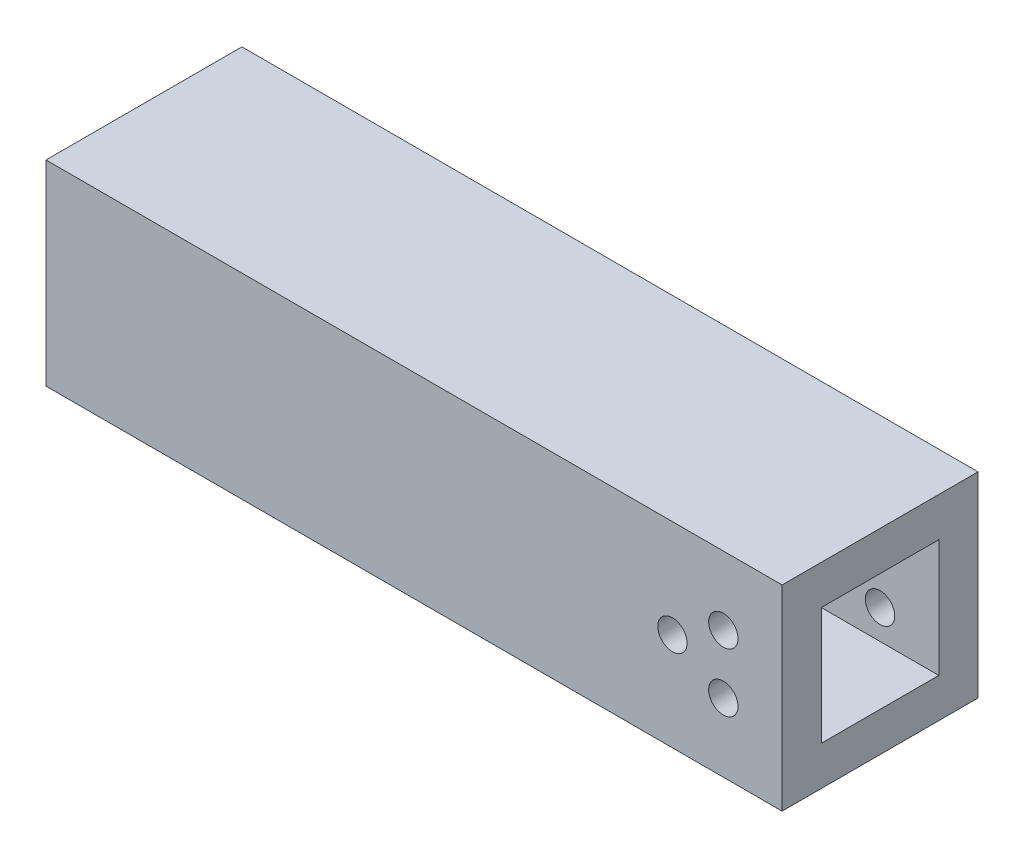
ISO-10303-21;
HEADER;
FILE_DESCRIPTION(('STEP AP214'),'2;1');
FILE_NAME('part.step','',(''),(''),'','','');
FILE_SCHEMA(('AUTOMOTIVE_DESIGN { 1 0 10303 214 1 1 1 1 }'));
ENDSEC;
DATA;
#1=APPLICATION_CONTEXT('core data for automotive mechanical design processes');
#2=APPLICATION_PROTOCOL_DEFINITION('international standard','automotive_design',2000,#1);
#3=PRODUCT_CONTEXT('',#1,'mechanical');
#4=PRODUCT('Part','Part','',(#3));
#5=PRODUCT_RELATED_PRODUCT_CATEGORY('part','',(#4));
#6=PRODUCT_DEFINITION_FORMATION('','',#4);
#7=PRODUCT_DEFINITION_CONTEXT('part definition',#1,'design');
#8=PRODUCT_DEFINITION('design','',#6,#7);
#9=PRODUCT_DEFINITION_SHAPE('','',#8);
#10=(LENGTH_UNIT() NAMED_UNIT(*) SI_UNIT(.MILLI.,.METRE.));
#11=(NAMED_UNIT(*) PLANE_ANGLE_UNIT() SI_UNIT($,.RADIAN.));
#12=(NAMED_UNIT(*) SI_UNIT($,.STERADIAN.) SOLID_ANGLE_UNIT());
#13=UNCERTAINTY_MEASURE_WITH_UNIT(LENGTH_MEASURE(1.E-05),#10,'distance_accuracy_value','');
#14=(GEOMETRIC_REPRESENTATION_CONTEXT(3) GLOBAL_UNCERTAINTY_ASSIGNED_CONTEXT((#13)) GLOBAL_UNIT_ASSIGNED_CONTEXT((#10,
#11,#12)) REPRESENTATION_CONTEXT('',''));
#15=CARTESIAN_POINT('',(0.,0.,0.));
#16=DIRECTION('',(0.,0.,1.));
#17=DIRECTION('',(1.,0.,0.));
#18=AXIS2_PLACEMENT_3D('',#15,#16,#17);
#19=CARTESIAN_POINT('',(0.,0.,0.));
#20=DIRECTION('',(1.,0.,0.));
#21=DIRECTION('',(0.,0.,-1.));
#22=AXIS2_PLACEMENT_3D('',#19,#20,#21);
#23=PLANE('',#22);
#24=DIRECTION('',(0.,0.,-1.));
#25=VECTOR('',#24,1.);
#26=CARTESIAN_POINT('',(0.,-19.05,19.05));
#27=LINE('',#26,#25);
#28=CARTESIAN_POINT('',(0.,-19.05,19.05));
#29=VERTEX_POINT('',#28);
#30=CARTESIAN_POINT('',(0.,-19.05,-19.05));
#31=VERTEX_POINT('',#30);
#32=EDGE_CURVE('E64',#29,#31,#27,.T.);
#33=ORIENTED_EDGE('',*,*,#32,.T.);
#34=DIRECTION('',(0.,1.,0.));
#35=VECTOR('',#34,1.);
#36=CARTESIAN_POINT('',(0.,-19.05,-19.05));
#37=LINE('',#36,#35);
#38=CARTESIAN_POINT('',(0.,19.05,-19.05));
#39=VERTEX_POINT('',#38);
#40=EDGE_CURVE('E150',#31,#39,#37,.T.);
#41=ORIENTED_EDGE('',*,*,#40,.T.);
#42=DIRECTION('',(0.,0.,1.));
#43=VECTOR('',#42,1.);
#44=CARTESIAN_POINT('',(0.,19.05,19.05));
#45=LINE('',#44,#43);
#46=CARTESIAN_POINT('',(0.,19.05,19.05));
#47=VERTEX_POINT('',#46);
#48=EDGE_CURVE('E153',#39,#47,#45,.T.);
#49=ORIENTED_EDGE('',*,*,#48,.T.);
#50=DIRECTION('',(0.,-1.,0.));
#51=VECTOR('',#50,1.);
#52=CARTESIAN_POINT('',(0.,-19.05,19.05));
#53=LINE('',#52,#51);
#54=EDGE_CURVE('E142',#47,#29,#53,.T.);
#55=ORIENTED_EDGE('',*,*,#54,.T.);
#56=EDGE_LOOP('',(#33,#41,#49,#55));
#57=FACE_BOUND('',#56,.T.);
#58=CARTESIAN_POINT('',(0.,0.,0.));
#59=DIRECTION('',(-1.,0.,0.));
#60=DIRECTION('',(0.,0.,1.));
#61=AXIS2_PLACEMENT_3D('',#58,#59,#60);
#62=CIRCLE('',#61,26.9875);
#63=CARTESIAN_POINT('',(0.,0.,26.9875));
#64=VERTEX_POINT('',#63);
#65=EDGE_CURVE('E133',#64,#64,#62,.T.);
#66=ORIENTED_EDGE('',*,*,#65,.T.);
#67=EDGE_LOOP('',(#66));
#68=FACE_BOUND('',#67,.T.);
#69=ADVANCED_FACE('F41',(#57,#68),#23,.F.);
#70=CARTESIAN_POINT('',(50.8,0.,0.));
#71=DIRECTION('',(1.,0.,0.));
#72=DIRECTION('',(0.,0.,-1.));
#73=AXIS2_PLACEMENT_3D('',#70,#71,#72);
#74=PLANE('',#73);
#75=DIRECTION('',(0.,0.,-1.));
#76=VECTOR('',#75,1.);
#77=CARTESIAN_POINT('',(50.8,-31.75,31.75));
#78=LINE('',#77,#76);
#79=CARTESIAN_POINT('',(50.8,-31.75,31.75));
#80=VERTEX_POINT('',#79);
#81=CARTESIAN_POINT('',(50.8,-31.75,-31.75));
#82=VERTEX_POINT('',#81);
#83=EDGE_CURVE('E164',#80,#82,#78,.T.);
#84=ORIENTED_EDGE('',*,*,#83,.T.);
#85=DIRECTION('',(0.,1.,0.));
#86=VECTOR('',#85,1.);
#87=CARTESIAN_POINT('',(50.8,-31.75,-31.75));
#88=LINE('',#87,#86);
#89=CARTESIAN_POINT('',(50.8,31.75,-31.75));
#90=VERTEX_POINT('',#89);
#91=EDGE_CURVE('E112',#82,#90,#88,.T.);
#92=ORIENTED_EDGE('',*,*,#91,.T.);
#93=DIRECTION('',(0.,0.,1.));
#94=VECTOR('',#93,1.);
#95=CARTESIAN_POINT('',(50.8,31.75,31.75));
#96=LINE('',#95,#94);
#97=CARTESIAN_POINT('',(50.8,31.75,31.75));
#98=VERTEX_POINT('',#97);
#99=EDGE_CURVE('E167',#90,#98,#96,.T.);
#100=ORIENTED_EDGE('',*,*,#99,.T.);
#101=DIRECTION('',(0.,-1.,0.));
#102=VECTOR('',#101,1.);
#103=CARTESIAN_POINT('',(50.8,-31.75,31.75));
#104=LINE('',#103,#102);
#105=EDGE_CURVE('E169',#98,#80,#104,.T.);
#106=ORIENTED_EDGE('',*,*,#105,.T.);
#107=EDGE_LOOP('',(#84,#92,#100,#106));
#108=FACE_BOUND('',#107,.T.);
#109=DIRECTION('',(0.,1.,0.));
#110=VECTOR('',#109,1.);
#111=CARTESIAN_POINT('',(50.8,-19.05,-19.05));
#112=LINE('',#111,#110);
#113=CARTESIAN_POINT('',(50.8,-19.05,-19.05));
#114=VERTEX_POINT('',#113);
#115=CARTESIAN_POINT('',(50.8,19.05,-19.05));
#116=VERTEX_POINT('',#115);
#117=EDGE_CURVE('E141',#114,#116,#112,.T.);
#118=ORIENTED_EDGE('',*,*,#117,.F.);
#119=DIRECTION('',(0.,0.,-1.));
#120=VECTOR('',#119,1.);
#121=CARTESIAN_POINT('',(50.8,-19.05,19.05));
#122=LINE('',#121,#120);
#123=CARTESIAN_POINT('',(50.8,-19.05,19.05));
#124=VERTEX_POINT('',#123);
#125=EDGE_CURVE('E139',#124,#114,#122,.T.);
#126=ORIENTED_EDGE('',*,*,#125,.F.);
#127=DIRECTION('',(0.,-1.,0.));
#128=VECTOR('',#127,1.);
#129=CARTESIAN_POINT('',(50.8,-19.05,19.05));
#130=LINE('',#129,#128);
#131=CARTESIAN_POINT('',(50.8,19.05,19.05));
#132=VERTEX_POINT('',#131);
#133=EDGE_CURVE('E146',#132,#124,#130,.T.);
#134=ORIENTED_EDGE('',*,*,#133,.F.);
#135=DIRECTION('',(0.,0.,1.));
#136=VECTOR('',#135,1.);
#137=CARTESIAN_POINT('',(50.8,19.05,19.05));
#138=LINE('',#137,#136);
#139=EDGE_CURVE('E144',#116,#132,#138,.T.);
#140=ORIENTED_EDGE('',*,*,#139,.F.);
#141=EDGE_LOOP('',(#118,#126,#134,#140));
#142=FACE_BOUND('',#141,.T.);
#143=ADVANCED_FACE('F179',(#108,#142),#74,.T.);
#144=CARTESIAN_POINT('',(50.8,-31.75,31.75));
#145=DIRECTION('',(0.,1.,0.));
#146=DIRECTION('',(0.,0.,1.));
#147=AXIS2_PLACEMENT_3D('',#144,#145,#146);
#148=PLANE('',#147);
#149=DIRECTION('',(-1.,0.,0.));
#150=VECTOR('',#149,1.);
#151=CARTESIAN_POINT('',(50.8,-31.75,31.75));
#152=LINE('',#151,#150);
#153=CARTESIAN_POINT('',(-187.8,-31.75,31.75));
#154=VERTEX_POINT('',#153);
#155=EDGE_CURVE('E119',#80,#154,#152,.T.);
#156=ORIENTED_EDGE('',*,*,#155,.T.);
#157=DIRECTION('',(0.,0.,1.));
#158=VECTOR('',#157,1.);
#159=CARTESIAN_POINT('',(-187.8,-31.75,-31.75));
#160=LINE('',#159,#158);
#161=CARTESIAN_POINT('',(-187.8,-31.75,-31.75));
#162=VERTEX_POINT('',#161);
#163=EDGE_CURVE('E117',#162,#154,#160,.T.);
#164=ORIENTED_EDGE('',*,*,#163,.F.);
#165=DIRECTION('',(-1.,0.,0.));
#166=VECTOR('',#165,1.);
#167=CARTESIAN_POINT('',(50.8,-31.75,-31.75));
#168=LINE('',#167,#166);
#169=EDGE_CURVE('E11',#82,#162,#168,.T.);
#170=ORIENTED_EDGE('',*,*,#169,.F.);
#171=ORIENTED_EDGE('',*,*,#83,.F.);
#172=EDGE_LOOP('',(#156,#164,#170,#171));
#173=FACE_BOUND('',#172,.T.);
#174=ADVANCED_FACE('F43',(#173),#148,.F.);
#175=CARTESIAN_POINT('',(50.8,-31.75,-31.75));
#176=DIRECTION('',(0.,0.,1.));
#177=DIRECTION('',(1.,0.,0.));
#178=AXIS2_PLACEMENT_3D('',#175,#176,#177);
#179=PLANE('',#178);
#180=CARTESIAN_POINT('',(31.75,9.52499999999999,-31.75));
#181=DIRECTION('',(0.,0.,-1.));
#182=DIRECTION('',(-1.,0.,0.));
#183=AXIS2_PLACEMENT_3D('',#180,#181,#182);
#184=CIRCLE('',#183,4.76249999999999);
#185=CARTESIAN_POINT('',(26.9875,9.52499999999999,-31.75));
#186=VERTEX_POINT('',#185);
#187=EDGE_CURVE('E269',#186,#186,#184,.T.);
#188=ORIENTED_EDGE('',*,*,#187,.F.);
#189=EDGE_LOOP('',(#188));
#190=FACE_BOUND('',#189,.T.);
#191=CARTESIAN_POINT('',(31.75,-9.52500000000001,-31.75));
#192=DIRECTION('',(0.,0.,-1.));
#193=DIRECTION('',(-1.,0.,0.));
#194=AXIS2_PLACEMENT_3D('',#191,#192,#193);
#195=CIRCLE('',#194,4.76249999999999);
#196=CARTESIAN_POINT('',(26.9875,-9.52500000000001,-31.75));
#197=VERTEX_POINT('',#196);
#198=EDGE_CURVE('E275',#197,#197,#195,.T.);
#199=ORIENTED_EDGE('',*,*,#198,.F.);
#200=EDGE_LOOP('',(#199));
#201=FACE_BOUND('',#200,.T.);
#202=CARTESIAN_POINT('',(15.2522160579064,0.,-31.75));
#203=DIRECTION('',(0.,0.,-1.));
#204=DIRECTION('',(-1.,0.,0.));
#205=AXIS2_PLACEMENT_3D('',#202,#203,#204);
#206=CIRCLE('',#205,4.76249999999999);
#207=CARTESIAN_POINT('',(10.4897160579065,0.,-31.75));
#208=VERTEX_POINT('',#207);
#209=EDGE_CURVE('E281',#208,#208,#206,.T.);
#210=ORIENTED_EDGE('',*,*,#209,.F.);
#211=EDGE_LOOP('',(#210));
#212=FACE_BOUND('',#211,.T.);
#213=ORIENTED_EDGE('',*,*,#169,.T.);
#214=DIRECTION('',(0.,-1.,0.));
#215=VECTOR('',#214,1.);
#216=CARTESIAN_POINT('',(-187.8,31.75,-31.75));
#217=LINE('',#216,#215);
#218=CARTESIAN_POINT('',(-187.8,31.75,-31.75));
#219=VERTEX_POINT('',#218);
#220=EDGE_CURVE('E111',#219,#162,#217,.T.);
#221=ORIENTED_EDGE('',*,*,#220,.F.);
#222=DIRECTION('',(-1.,0.,0.));
#223=VECTOR('',#222,1.);
#224=CARTESIAN_POINT('',(50.8,31.75,-31.75));
#225=LINE('',#224,#223);
#226=EDGE_CURVE('E49',#90,#219,#225,.T.);
#227=ORIENTED_EDGE('',*,*,#226,.F.);
#228=ORIENTED_EDGE('',*,*,#91,.F.);
#229=EDGE_LOOP('',(#213,#221,#227,#228));
#230=FACE_BOUND('',#229,.T.);
#231=ADVANCED_FACE('F108',(#190,#201,#212,#230),#179,.F.);
#232=CARTESIAN_POINT('',(50.8,31.75,31.75));
#233=DIRECTION('',(0.,-1.,0.));
#234=DIRECTION('',(0.,0.,-1.));
#235=AXIS2_PLACEMENT_3D('',#232,#233,#234);
#236=PLANE('',#235);
#237=ORIENTED_EDGE('',*,*,#226,.T.);
#238=DIRECTION('',(0.,0.,-1.));
#239=VECTOR('',#238,1.);
#240=CARTESIAN_POINT('',(-187.8,31.75,-31.75));
#241=LINE('',#240,#239);
#242=CARTESIAN_POINT('',(-187.8,31.75,31.75));
#243=VERTEX_POINT('',#242);
#244=EDGE_CURVE('E129',#243,#219,#241,.T.);
#245=ORIENTED_EDGE('',*,*,#244,.F.);
#246=DIRECTION('',(-1.,0.,0.));
#247=VECTOR('',#246,1.);
#248=CARTESIAN_POINT('',(50.8,31.75,31.75));
#249=LINE('',#248,#247);
#250=EDGE_CURVE('E172',#98,#243,#249,.T.);
#251=ORIENTED_EDGE('',*,*,#250,.F.);
#252=ORIENTED_EDGE('',*,*,#99,.F.);
#253=EDGE_LOOP('',(#237,#245,#251,#252));
#254=FACE_BOUND('',#253,.T.);
#255=ADVANCED_FACE('F175',(#254),#236,.F.);
#256=CARTESIAN_POINT('',(50.8,-31.75,31.75));
#257=DIRECTION('',(0.,0.,-1.));
#258=DIRECTION('',(-1.,0.,0.));
#259=AXIS2_PLACEMENT_3D('',#256,#257,#258);
#260=PLANE('',#259);
#261=CARTESIAN_POINT('',(31.75,9.52499999999999,31.75));
#262=DIRECTION('',(0.,0.,1.));
#263=DIRECTION('',(1.,0.,0.));
#264=AXIS2_PLACEMENT_3D('',#261,#262,#263);
#265=CIRCLE('',#264,4.76249999999999);
#266=CARTESIAN_POINT('',(36.5125,9.52499999999999,31.75));
#267=VERTEX_POINT('',#266);
#268=EDGE_CURVE('E253',#267,#267,#265,.T.);
#269=ORIENTED_EDGE('',*,*,#268,.F.);
#270=EDGE_LOOP('',(#269));
#271=FACE_BOUND('',#270,.T.);
#272=CARTESIAN_POINT('',(15.2522160579065,0.,31.75));
#273=DIRECTION('',(0.,0.,1.));
#274=DIRECTION('',(1.,0.,0.));
#275=AXIS2_PLACEMENT_3D('',#272,#273,#274);
#276=CIRCLE('',#275,4.76249999999999);
#277=CARTESIAN_POINT('',(20.0147160579064,0.,31.75));
#278=VERTEX_POINT('',#277);
#279=EDGE_CURVE('E255',#278,#278,#276,.T.);
#280=ORIENTED_EDGE('',*,*,#279,.F.);
#281=EDGE_LOOP('',(#280));
#282=FACE_BOUND('',#281,.T.);
#283=CARTESIAN_POINT('',(31.75,-9.52500000000001,31.75));
#284=DIRECTION('',(0.,0.,1.));
#285=DIRECTION('',(1.,0.,0.));
#286=AXIS2_PLACEMENT_3D('',#283,#284,#285);
#287=CIRCLE('',#286,4.76249999999999);
#288=CARTESIAN_POINT('',(36.5125,-9.52500000000001,31.75));
#289=VERTEX_POINT('',#288);
#290=EDGE_CURVE('E263',#289,#289,#287,.T.);
#291=ORIENTED_EDGE('',*,*,#290,.F.);
#292=EDGE_LOOP('',(#291));
#293=FACE_BOUND('',#292,.T.);
#294=ORIENTED_EDGE('',*,*,#250,.T.);
#295=DIRECTION('',(0.,1.,0.));
#296=VECTOR('',#295,1.);
#297=CARTESIAN_POINT('',(-187.8,31.75,31.75));
#298=LINE('',#297,#296);
#299=EDGE_CURVE('E123',#154,#243,#298,.T.);
#300=ORIENTED_EDGE('',*,*,#299,.F.);
#301=ORIENTED_EDGE('',*,*,#155,.F.);
#302=ORIENTED_EDGE('',*,*,#105,.F.);
#303=EDGE_LOOP('',(#294,#300,#301,#302));
#304=FACE_BOUND('',#303,.T.);
#305=ADVANCED_FACE('F182',(#271,#282,#293,#304),#260,.F.);
#306=CARTESIAN_POINT('',(50.8,-19.05,19.05));
#307=DIRECTION('',(0.,1.,0.));
#308=DIRECTION('',(0.,0.,1.));
#309=AXIS2_PLACEMENT_3D('',#306,#307,#308);
#310=PLANE('',#309);
#311=ORIENTED_EDGE('',*,*,#32,.F.);
#312=DIRECTION('',(-1.,0.,0.));
#313=VECTOR('',#312,1.);
#314=CARTESIAN_POINT('',(50.8,-19.05,19.05));
#315=LINE('',#314,#313);
#316=EDGE_CURVE('E148',#124,#29,#315,.T.);
#317=ORIENTED_EDGE('',*,*,#316,.F.);
#318=ORIENTED_EDGE('',*,*,#125,.T.);
#319=DIRECTION('',(-1.,0.,0.));
#320=VECTOR('',#319,1.);
#321=CARTESIAN_POINT('',(50.8,-19.05,-19.05));
#322=LINE('',#321,#320);
#323=EDGE_CURVE('E162',#114,#31,#322,.T.);
#324=ORIENTED_EDGE('',*,*,#323,.T.);
#325=EDGE_LOOP('',(#311,#317,#318,#324));
#326=FACE_BOUND('',#325,.T.);
#327=ADVANCED_FACE('F184',(#326),#310,.T.);
#328=CARTESIAN_POINT('',(50.8,-19.05,-19.05));
#329=DIRECTION('',(0.,0.,1.));
#330=DIRECTION('',(1.,0.,0.));
#331=AXIS2_PLACEMENT_3D('',#328,#329,#330);
#332=PLANE('',#331);
#333=CARTESIAN_POINT('',(31.75,9.52499999999999,-19.05));
#334=DIRECTION('',(0.,0.,-1.));
#335=DIRECTION('',(-1.,0.,0.));
#336=AXIS2_PLACEMENT_3D('',#333,#334,#335);
#337=CIRCLE('',#336,4.76249999999999);
#338=CARTESIAN_POINT('',(26.9875,9.52499999999999,-19.05));
#339=VERTEX_POINT('',#338);
#340=EDGE_CURVE('E272',#339,#339,#337,.T.);
#341=ORIENTED_EDGE('',*,*,#340,.T.);
#342=EDGE_LOOP('',(#341));
#343=FACE_BOUND('',#342,.T.);
#344=CARTESIAN_POINT('',(31.75,-9.52500000000001,-19.05));
#345=DIRECTION('',(0.,0.,-1.));
#346=DIRECTION('',(-1.,0.,0.));
#347=AXIS2_PLACEMENT_3D('',#344,#345,#346);
#348=CIRCLE('',#347,4.76249999999999);
#349=CARTESIAN_POINT('',(26.9875,-9.52500000000001,-19.05));
#350=VERTEX_POINT('',#349);
#351=EDGE_CURVE('E278',#350,#350,#348,.T.);
#352=ORIENTED_EDGE('',*,*,#351,.T.);
#353=EDGE_LOOP('',(#352));
#354=FACE_BOUND('',#353,.T.);
#355=CARTESIAN_POINT('',(15.2522160579064,0.,-19.05));
#356=DIRECTION('',(0.,0.,-1.));
#357=DIRECTION('',(-1.,0.,0.));
#358=AXIS2_PLACEMENT_3D('',#355,#356,#357);
#359=CIRCLE('',#358,4.76249999999999);
#360=CARTESIAN_POINT('',(10.4897160579065,0.,-19.05));
#361=VERTEX_POINT('',#360);
#362=EDGE_CURVE('E284',#361,#361,#359,.T.);
#363=ORIENTED_EDGE('',*,*,#362,.T.);
#364=EDGE_LOOP('',(#363));
#365=FACE_BOUND('',#364,.T.);
#366=ORIENTED_EDGE('',*,*,#40,.F.);
#367=ORIENTED_EDGE('',*,*,#323,.F.);
#368=ORIENTED_EDGE('',*,*,#117,.T.);
#369=DIRECTION('',(-1.,0.,0.));
#370=VECTOR('',#369,1.);
#371=CARTESIAN_POINT('',(50.8,19.05,-19.05));
#372=LINE('',#371,#370);
#373=EDGE_CURVE('E160',#116,#39,#372,.T.);
#374=ORIENTED_EDGE('',*,*,#373,.T.);
#375=EDGE_LOOP('',(#366,#367,#368,#374));
#376=FACE_BOUND('',#375,.T.);
#377=ADVANCED_FACE('F192',(#343,#354,#365,#376),#332,.T.);
#378=CARTESIAN_POINT('',(50.8,19.05,19.05));
#379=DIRECTION('',(0.,-1.,0.));
#380=DIRECTION('',(0.,0.,-1.));
#381=AXIS2_PLACEMENT_3D('',#378,#379,#380);
#382=PLANE('',#381);
#383=ORIENTED_EDGE('',*,*,#48,.F.);
#384=ORIENTED_EDGE('',*,*,#373,.F.);
#385=ORIENTED_EDGE('',*,*,#139,.T.);
#386=DIRECTION('',(-1.,0.,0.));
#387=VECTOR('',#386,1.);
#388=CARTESIAN_POINT('',(50.8,19.05,19.05));
#389=LINE('',#388,#387);
#390=EDGE_CURVE('E56',#132,#47,#389,.T.);
#391=ORIENTED_EDGE('',*,*,#390,.T.);
#392=EDGE_LOOP('',(#383,#384,#385,#391));
#393=FACE_BOUND('',#392,.T.);
#394=ADVANCED_FACE('F211',(#393),#382,.T.);
#395=CARTESIAN_POINT('',(50.8,-19.05,19.05));
#396=DIRECTION('',(0.,0.,-1.));
#397=DIRECTION('',(-1.,0.,0.));
#398=AXIS2_PLACEMENT_3D('',#395,#396,#397);
#399=PLANE('',#398);
#400=CARTESIAN_POINT('',(31.75,9.52499999999999,19.05));
#401=DIRECTION('',(0.,0.,1.));
#402=DIRECTION('',(1.,0.,0.));
#403=AXIS2_PLACEMENT_3D('',#400,#401,#402);
#404=CIRCLE('',#403,4.76249999999999);
#405=CARTESIAN_POINT('',(36.5125,9.52499999999999,19.05));
#406=VERTEX_POINT('',#405);
#407=EDGE_CURVE('E251',#406,#406,#404,.T.);
#408=ORIENTED_EDGE('',*,*,#407,.T.);
#409=EDGE_LOOP('',(#408));
#410=FACE_BOUND('',#409,.T.);
#411=CARTESIAN_POINT('',(15.2522160579065,0.,19.05));
#412=DIRECTION('',(0.,0.,1.));
#413=DIRECTION('',(1.,0.,0.));
#414=AXIS2_PLACEMENT_3D('',#411,#412,#413);
#415=CIRCLE('',#414,4.76249999999999);
#416=CARTESIAN_POINT('',(20.0147160579064,0.,19.05));
#417=VERTEX_POINT('',#416);
#418=EDGE_CURVE('E260',#417,#417,#415,.T.);
#419=ORIENTED_EDGE('',*,*,#418,.T.);
#420=EDGE_LOOP('',(#419));
#421=FACE_BOUND('',#420,.T.);
#422=CARTESIAN_POINT('',(31.75,-9.52500000000001,19.05));
#423=DIRECTION('',(0.,0.,1.));
#424=DIRECTION('',(1.,0.,0.));
#425=AXIS2_PLACEMENT_3D('',#422,#423,#424);
#426=CIRCLE('',#425,4.76249999999999);
#427=CARTESIAN_POINT('',(36.5125,-9.52500000000001,19.05));
#428=VERTEX_POINT('',#427);
#429=EDGE_CURVE('E266',#428,#428,#426,.T.);
#430=ORIENTED_EDGE('',*,*,#429,.T.);
#431=EDGE_LOOP('',(#430));
#432=FACE_BOUND('',#431,.T.);
#433=ORIENTED_EDGE('',*,*,#54,.F.);
#434=ORIENTED_EDGE('',*,*,#390,.F.);
#435=ORIENTED_EDGE('',*,*,#133,.T.);
#436=ORIENTED_EDGE('',*,*,#316,.T.);
#437=EDGE_LOOP('',(#433,#434,#435,#436));
#438=FACE_BOUND('',#437,.T.);
#439=ADVANCED_FACE('F214',(#410,#421,#432,#438),#399,.T.);
#440=CARTESIAN_POINT('',(-187.8,0.,0.));
#441=DIRECTION('',(-1.,0.,0.));
#442=DIRECTION('',(0.,0.,1.));
#443=AXIS2_PLACEMENT_3D('',#440,#441,#442);
#444=PLANE('',#443);
#445=ORIENTED_EDGE('',*,*,#220,.T.);
#446=ORIENTED_EDGE('',*,*,#163,.T.);
#447=ORIENTED_EDGE('',*,*,#299,.T.);
#448=ORIENTED_EDGE('',*,*,#244,.T.);
#449=EDGE_LOOP('',(#445,#446,#447,#448));
#450=FACE_BOUND('',#449,.T.);
#451=CARTESIAN_POINT('',(-187.8,0.,0.));
#452=DIRECTION('',(-1.,0.,0.));
#453=DIRECTION('',(0.,0.,1.));
#454=AXIS2_PLACEMENT_3D('',#451,#452,#453);
#455=CIRCLE('',#454,26.9875);
#456=CARTESIAN_POINT('',(-187.8,0.,26.9875));
#457=VERTEX_POINT('',#456);
#458=EDGE_CURVE('E130',#457,#457,#455,.T.);
#459=ORIENTED_EDGE('',*,*,#458,.F.);
#460=EDGE_LOOP('',(#459));
#461=FACE_BOUND('',#460,.T.);
#462=ADVANCED_FACE('F126',(#450,#461),#444,.T.);
#463=CARTESIAN_POINT('',(-187.8,0.,0.));
#464=DIRECTION('',(1.,0.,0.));
#465=DIRECTION('',(0.,0.,-1.));
#466=AXIS2_PLACEMENT_3D('',#463,#464,#465);
#467=CYLINDRICAL_SURFACE('',#466,26.9875);
#468=ORIENTED_EDGE('',*,*,#458,.T.);
#469=EDGE_LOOP('',(#468));
#470=FACE_BOUND('',#469,.T.);
#471=ORIENTED_EDGE('',*,*,#65,.F.);
#472=EDGE_LOOP('',(#471));
#473=FACE_BOUND('',#472,.T.);
#474=ADVANCED_FACE('F220',(#470,#473),#467,.F.);
#475=CARTESIAN_POINT('',(15.2522160579064,0.,-31.75));
#476=DIRECTION('',(0.,0.,-1.));
#477=DIRECTION('',(-1.,0.,0.));
#478=AXIS2_PLACEMENT_3D('',#475,#476,#477);
#479=CYLINDRICAL_SURFACE('',#478,4.76249999999999);
#480=ORIENTED_EDGE('',*,*,#362,.F.);
#481=EDGE_LOOP('',(#480));
#482=FACE_BOUND('',#481,.T.);
#483=ORIENTED_EDGE('',*,*,#209,.T.);
#484=EDGE_LOOP('',(#483));
#485=FACE_BOUND('',#484,.T.);
#486=ADVANCED_FACE('F223',(#482,#485),#479,.F.);
#487=CARTESIAN_POINT('',(31.75,-9.52500000000001,-31.75));
#488=DIRECTION('',(0.,0.,-1.));
#489=DIRECTION('',(-1.,0.,0.));
#490=AXIS2_PLACEMENT_3D('',#487,#488,#489);
#491=CYLINDRICAL_SURFACE('',#490,4.76249999999999);
#492=ORIENTED_EDGE('',*,*,#351,.F.);
#493=EDGE_LOOP('',(#492));
#494=FACE_BOUND('',#493,.T.);
#495=ORIENTED_EDGE('',*,*,#198,.T.);
#496=EDGE_LOOP('',(#495));
#497=FACE_BOUND('',#496,.T.);
#498=ADVANCED_FACE('F227',(#494,#497),#491,.F.);
#499=CARTESIAN_POINT('',(31.75,9.52499999999999,-31.75));
#500=DIRECTION('',(0.,0.,-1.));
#501=DIRECTION('',(-1.,0.,0.));
#502=AXIS2_PLACEMENT_3D('',#499,#500,#501);
#503=CYLINDRICAL_SURFACE('',#502,4.76249999999999);
#504=ORIENTED_EDGE('',*,*,#340,.F.);
#505=EDGE_LOOP('',(#504));
#506=FACE_BOUND('',#505,.T.);
#507=ORIENTED_EDGE('',*,*,#187,.T.);
#508=EDGE_LOOP('',(#507));
#509=FACE_BOUND('',#508,.T.);
#510=ADVANCED_FACE('F231',(#506,#509),#503,.F.);
#511=CARTESIAN_POINT('',(31.75,-9.52500000000001,31.75));
#512=DIRECTION('',(0.,0.,1.));
#513=DIRECTION('',(1.,0.,0.));
#514=AXIS2_PLACEMENT_3D('',#511,#512,#513);
#515=CYLINDRICAL_SURFACE('',#514,4.76249999999999);
#516=ORIENTED_EDGE('',*,*,#429,.F.);
#517=EDGE_LOOP('',(#516));
#518=FACE_BOUND('',#517,.T.);
#519=ORIENTED_EDGE('',*,*,#290,.T.);
#520=EDGE_LOOP('',(#519));
#521=FACE_BOUND('',#520,.T.);
#522=ADVANCED_FACE('F234',(#518,#521),#515,.F.);
#523=CARTESIAN_POINT('',(15.2522160579065,0.,31.75));
#524=DIRECTION('',(0.,0.,1.));
#525=DIRECTION('',(1.,0.,0.));
#526=AXIS2_PLACEMENT_3D('',#523,#524,#525);
#527=CYLINDRICAL_SURFACE('',#526,4.76249999999999);
#528=ORIENTED_EDGE('',*,*,#418,.F.);
#529=EDGE_LOOP('',(#528));
#530=FACE_BOUND('',#529,.T.);
#531=ORIENTED_EDGE('',*,*,#279,.T.);
#532=EDGE_LOOP('',(#531));
#533=FACE_BOUND('',#532,.T.);
#534=ADVANCED_FACE('F238',(#530,#533),#527,.F.);
#535=CARTESIAN_POINT('',(31.75,9.52499999999999,31.75));
#536=DIRECTION('',(0.,0.,1.));
#537=DIRECTION('',(1.,0.,0.));
#538=AXIS2_PLACEMENT_3D('',#535,#536,#537);
#539=CYLINDRICAL_SURFACE('',#538,4.76249999999999);
#540=ORIENTED_EDGE('',*,*,#407,.F.);
#541=EDGE_LOOP('',(#540));
#542=FACE_BOUND('',#541,.T.);
#543=ORIENTED_EDGE('',*,*,#268,.T.);
#544=EDGE_LOOP('',(#543));
#545=FACE_BOUND('',#544,.T.);
#546=ADVANCED_FACE('F242',(#542,#545),#539,.F.);
#547=CLOSED_SHELL('',(#69,#143,#174,#231,#255,#305,#327,#377,#394,#439,#462,#474,#486,#498,#510,
#522,#534,#546));
#548=MANIFOLD_SOLID_BREP('B2',#547);
#549=ADVANCED_BREP_SHAPE_REPRESENTATION('',(#18,#548),#14);
#550=SHAPE_DEFINITION_REPRESENTATION(#9,#549);
ENDSEC;
END-ISO-10303-21;
